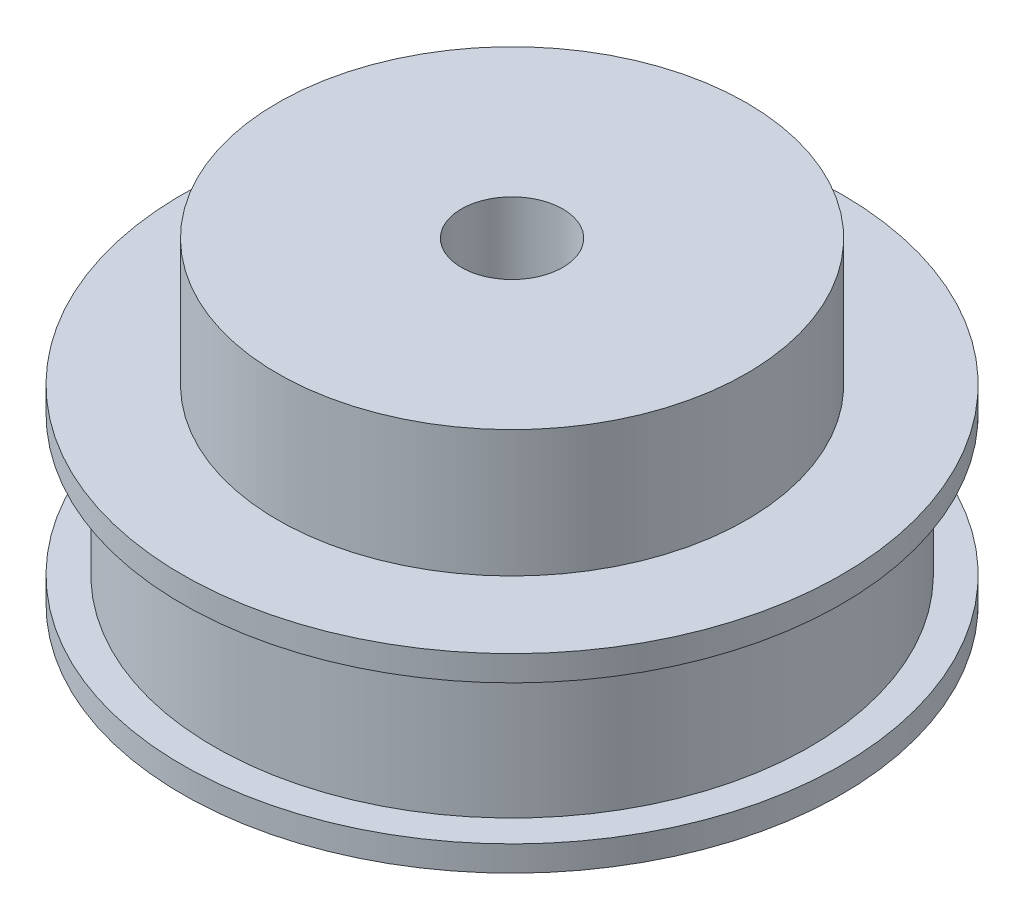
ISO-10303-21;
HEADER;
FILE_DESCRIPTION(('STEP AP214'),'2;1');
FILE_NAME('part.step','',(''),(''),'','','');
FILE_SCHEMA(('AUTOMOTIVE_DESIGN { 1 0 10303 214 1 1 1 1 }'));
ENDSEC;
DATA;
#1=APPLICATION_CONTEXT('core data for automotive mechanical design processes');
#2=APPLICATION_PROTOCOL_DEFINITION('international standard','automotive_design',2000,#1);
#3=PRODUCT_CONTEXT('',#1,'mechanical');
#4=PRODUCT('Part','Part','',(#3));
#5=PRODUCT_RELATED_PRODUCT_CATEGORY('part','',(#4));
#6=PRODUCT_DEFINITION_FORMATION('','',#4);
#7=PRODUCT_DEFINITION_CONTEXT('part definition',#1,'design');
#8=PRODUCT_DEFINITION('design','',#6,#7);
#9=PRODUCT_DEFINITION_SHAPE('','',#8);
#10=(LENGTH_UNIT() NAMED_UNIT(*) SI_UNIT(.MILLI.,.METRE.));
#11=(NAMED_UNIT(*) PLANE_ANGLE_UNIT() SI_UNIT($,.RADIAN.));
#12=(NAMED_UNIT(*) SI_UNIT($,.STERADIAN.) SOLID_ANGLE_UNIT());
#13=UNCERTAINTY_MEASURE_WITH_UNIT(LENGTH_MEASURE(1.E-05),#10,'distance_accuracy_value','');
#14=(GEOMETRIC_REPRESENTATION_CONTEXT(3) GLOBAL_UNCERTAINTY_ASSIGNED_CONTEXT((#13)) GLOBAL_UNIT_ASSIGNED_CONTEXT((#10,
#11,#12)) REPRESENTATION_CONTEXT('',''));
#15=CARTESIAN_POINT('',(0.,0.,0.));
#16=DIRECTION('',(0.,0.,1.));
#17=DIRECTION('',(1.,0.,0.));
#18=AXIS2_PLACEMENT_3D('',#15,#16,#17);
#19=CARTESIAN_POINT('',(18.5,11.6742242087626,0.));
#20=DIRECTION('',(0.,1.,0.));
#21=DIRECTION('',(0.,0.,1.));
#22=AXIS2_PLACEMENT_3D('',#19,#20,#21);
#23=PLANE('',#22);
#24=CARTESIAN_POINT('',(0.,11.6742242087626,0.));
#25=DIRECTION('',(0.,-1.,0.));
#26=DIRECTION('',(0.,0.,-1.));
#27=AXIS2_PLACEMENT_3D('',#24,#25,#26);
#28=CIRCLE('',#27,4.);
#29=CARTESIAN_POINT('',(0.,11.6742242087626,-4.));
#30=VERTEX_POINT('',#29);
#31=EDGE_CURVE('E10',#30,#30,#28,.T.);
#32=ORIENTED_EDGE('',*,*,#31,.T.);
#33=EDGE_LOOP('',(#32));
#34=FACE_BOUND('',#33,.T.);
#35=CARTESIAN_POINT('',(0.,11.6742242087626,0.));
#36=DIRECTION('',(0.,-1.,0.));
#37=DIRECTION('',(0.,0.,-1.));
#38=AXIS2_PLACEMENT_3D('',#35,#36,#37);
#39=CIRCLE('',#38,18.5);
#40=CARTESIAN_POINT('',(0.,11.6742242087626,-18.5));
#41=VERTEX_POINT('',#40);
#42=EDGE_CURVE('E84',#41,#41,#39,.T.);
#43=ORIENTED_EDGE('',*,*,#42,.F.);
#44=EDGE_LOOP('',(#43));
#45=FACE_BOUND('',#44,.T.);
#46=ADVANCED_FACE('F41',(#34,#45),#23,.T.);
#47=CARTESIAN_POINT('',(0.,0.,0.));
#48=DIRECTION('',(0.,-1.,0.));
#49=DIRECTION('',(0.,0.,-1.));
#50=AXIS2_PLACEMENT_3D('',#47,#48,#49);
#51=CYLINDRICAL_SURFACE('',#50,4.);
#52=CARTESIAN_POINT('',(0.,-13.3257757912374,0.));
#53=DIRECTION('',(0.,-1.,0.));
#54=DIRECTION('',(0.,0.,-1.));
#55=AXIS2_PLACEMENT_3D('',#52,#53,#54);
#56=CIRCLE('',#55,4.);
#57=CARTESIAN_POINT('',(0.,-13.3257757912374,-4.));
#58=VERTEX_POINT('',#57);
#59=EDGE_CURVE('E48',#58,#58,#56,.T.);
#60=ORIENTED_EDGE('',*,*,#59,.T.);
#61=EDGE_LOOP('',(#60));
#62=FACE_BOUND('',#61,.T.);
#63=ORIENTED_EDGE('',*,*,#31,.F.);
#64=EDGE_LOOP('',(#63));
#65=FACE_BOUND('',#64,.T.);
#66=ADVANCED_FACE('F93',(#62,#65),#51,.F.);
#67=CARTESIAN_POINT('',(4.,-13.3257757912374,0.));
#68=DIRECTION('',(0.,-1.,0.));
#69=DIRECTION('',(0.,0.,-1.));
#70=AXIS2_PLACEMENT_3D('',#67,#68,#69);
#71=PLANE('',#70);
#72=CARTESIAN_POINT('',(0.,-13.3257757912374,0.));
#73=DIRECTION('',(0.,-1.,0.));
#74=DIRECTION('',(0.,0.,-1.));
#75=AXIS2_PLACEMENT_3D('',#72,#73,#74);
#76=CIRCLE('',#75,26.);
#77=CARTESIAN_POINT('',(0.,-13.3257757912374,-26.));
#78=VERTEX_POINT('',#77);
#79=EDGE_CURVE('E53',#78,#78,#76,.T.);
#80=ORIENTED_EDGE('',*,*,#79,.T.);
#81=EDGE_LOOP('',(#80));
#82=FACE_BOUND('',#81,.T.);
#83=ORIENTED_EDGE('',*,*,#59,.F.);
#84=EDGE_LOOP('',(#83));
#85=FACE_BOUND('',#84,.T.);
#86=ADVANCED_FACE('F97',(#82,#85),#71,.T.);
#87=CARTESIAN_POINT('',(0.,0.,0.));
#88=DIRECTION('',(0.,-1.,0.));
#89=DIRECTION('',(0.,0.,-1.));
#90=AXIS2_PLACEMENT_3D('',#87,#88,#89);
#91=CYLINDRICAL_SURFACE('',#90,26.);
#92=CARTESIAN_POINT('',(0.,-11.3257757912374,0.));
#93=DIRECTION('',(0.,-1.,0.));
#94=DIRECTION('',(0.,0.,-1.));
#95=AXIS2_PLACEMENT_3D('',#92,#93,#94);
#96=CIRCLE('',#95,26.);
#97=CARTESIAN_POINT('',(0.,-11.3257757912374,-26.));
#98=VERTEX_POINT('',#97);
#99=EDGE_CURVE('E58',#98,#98,#96,.T.);
#100=ORIENTED_EDGE('',*,*,#99,.T.);
#101=EDGE_LOOP('',(#100));
#102=FACE_BOUND('',#101,.T.);
#103=ORIENTED_EDGE('',*,*,#79,.F.);
#104=EDGE_LOOP('',(#103));
#105=FACE_BOUND('',#104,.T.);
#106=ADVANCED_FACE('F101',(#102,#105),#91,.T.);
#107=CARTESIAN_POINT('',(26.,-11.3257757912374,0.));
#108=DIRECTION('',(0.,1.,0.));
#109=DIRECTION('',(0.,0.,1.));
#110=AXIS2_PLACEMENT_3D('',#107,#108,#109);
#111=PLANE('',#110);
#112=CARTESIAN_POINT('',(0.,-11.3257757912374,0.));
#113=DIRECTION('',(0.,-1.,0.));
#114=DIRECTION('',(0.,0.,-1.));
#115=AXIS2_PLACEMENT_3D('',#112,#113,#114);
#116=CIRCLE('',#115,23.5);
#117=CARTESIAN_POINT('',(0.,-11.3257757912374,-23.5));
#118=VERTEX_POINT('',#117);
#119=EDGE_CURVE('E64',#118,#118,#116,.T.);
#120=ORIENTED_EDGE('',*,*,#119,.T.);
#121=EDGE_LOOP('',(#120));
#122=FACE_BOUND('',#121,.T.);
#123=ORIENTED_EDGE('',*,*,#99,.F.);
#124=EDGE_LOOP('',(#123));
#125=FACE_BOUND('',#124,.T.);
#126=ADVANCED_FACE('F108',(#122,#125),#111,.T.);
#127=CARTESIAN_POINT('',(0.,0.,0.));
#128=DIRECTION('',(0.,-1.,0.));
#129=DIRECTION('',(0.,0.,-1.));
#130=AXIS2_PLACEMENT_3D('',#127,#128,#129);
#131=CYLINDRICAL_SURFACE('',#130,23.5);
#132=CARTESIAN_POINT('',(0.,-0.32577579123738,0.));
#133=DIRECTION('',(0.,-1.,0.));
#134=DIRECTION('',(0.,0.,-1.));
#135=AXIS2_PLACEMENT_3D('',#132,#133,#134);
#136=CIRCLE('',#135,23.5);
#137=CARTESIAN_POINT('',(0.,-0.32577579123738,-23.5));
#138=VERTEX_POINT('',#137);
#139=EDGE_CURVE('E68',#138,#138,#136,.T.);
#140=ORIENTED_EDGE('',*,*,#139,.T.);
#141=EDGE_LOOP('',(#140));
#142=FACE_BOUND('',#141,.T.);
#143=ORIENTED_EDGE('',*,*,#119,.F.);
#144=EDGE_LOOP('',(#143));
#145=FACE_BOUND('',#144,.T.);
#146=ADVANCED_FACE('F112',(#142,#145),#131,.T.);
#147=CARTESIAN_POINT('',(23.5,-0.32577579123738,0.));
#148=DIRECTION('',(0.,-1.,0.));
#149=DIRECTION('',(0.,0.,-1.));
#150=AXIS2_PLACEMENT_3D('',#147,#148,#149);
#151=PLANE('',#150);
#152=CARTESIAN_POINT('',(0.,-0.32577579123738,0.));
#153=DIRECTION('',(0.,-1.,0.));
#154=DIRECTION('',(0.,0.,-1.));
#155=AXIS2_PLACEMENT_3D('',#152,#153,#154);
#156=CIRCLE('',#155,26.);
#157=CARTESIAN_POINT('',(0.,-0.32577579123738,-26.));
#158=VERTEX_POINT('',#157);
#159=EDGE_CURVE('E72',#158,#158,#156,.T.);
#160=ORIENTED_EDGE('',*,*,#159,.T.);
#161=EDGE_LOOP('',(#160));
#162=FACE_BOUND('',#161,.T.);
#163=ORIENTED_EDGE('',*,*,#139,.F.);
#164=EDGE_LOOP('',(#163));
#165=FACE_BOUND('',#164,.T.);
#166=ADVANCED_FACE('F116',(#162,#165),#151,.T.);
#167=CARTESIAN_POINT('',(0.,0.,0.));
#168=DIRECTION('',(0.,-1.,0.));
#169=DIRECTION('',(0.,0.,-1.));
#170=AXIS2_PLACEMENT_3D('',#167,#168,#169);
#171=CYLINDRICAL_SURFACE('',#170,26.);
#172=CARTESIAN_POINT('',(0.,1.67422420876262,0.));
#173=DIRECTION('',(0.,-1.,0.));
#174=DIRECTION('',(0.,0.,-1.));
#175=AXIS2_PLACEMENT_3D('',#172,#173,#174);
#176=CIRCLE('',#175,26.);
#177=CARTESIAN_POINT('',(0.,1.67422420876262,-26.));
#178=VERTEX_POINT('',#177);
#179=EDGE_CURVE('E76',#178,#178,#176,.T.);
#180=ORIENTED_EDGE('',*,*,#179,.T.);
#181=EDGE_LOOP('',(#180));
#182=FACE_BOUND('',#181,.T.);
#183=ORIENTED_EDGE('',*,*,#159,.F.);
#184=EDGE_LOOP('',(#183));
#185=FACE_BOUND('',#184,.T.);
#186=ADVANCED_FACE('F120',(#182,#185),#171,.T.);
#187=CARTESIAN_POINT('',(26.,1.67422420876262,0.));
#188=DIRECTION('',(0.,1.,0.));
#189=DIRECTION('',(0.,0.,1.));
#190=AXIS2_PLACEMENT_3D('',#187,#188,#189);
#191=PLANE('',#190);
#192=CARTESIAN_POINT('',(0.,1.67422420876262,0.));
#193=DIRECTION('',(0.,-1.,0.));
#194=DIRECTION('',(0.,0.,-1.));
#195=AXIS2_PLACEMENT_3D('',#192,#193,#194);
#196=CIRCLE('',#195,18.5);
#197=CARTESIAN_POINT('',(0.,1.67422420876262,-18.5));
#198=VERTEX_POINT('',#197);
#199=EDGE_CURVE('E80',#198,#198,#196,.T.);
#200=ORIENTED_EDGE('',*,*,#199,.T.);
#201=EDGE_LOOP('',(#200));
#202=FACE_BOUND('',#201,.T.);
#203=ORIENTED_EDGE('',*,*,#179,.F.);
#204=EDGE_LOOP('',(#203));
#205=FACE_BOUND('',#204,.T.);
#206=ADVANCED_FACE('F124',(#202,#205),#191,.T.);
#207=CARTESIAN_POINT('',(0.,0.,0.));
#208=DIRECTION('',(0.,-1.,0.));
#209=DIRECTION('',(0.,0.,-1.));
#210=AXIS2_PLACEMENT_3D('',#207,#208,#209);
#211=CYLINDRICAL_SURFACE('',#210,18.5);
#212=ORIENTED_EDGE('',*,*,#42,.T.);
#213=EDGE_LOOP('',(#212));
#214=FACE_BOUND('',#213,.T.);
#215=ORIENTED_EDGE('',*,*,#199,.F.);
#216=EDGE_LOOP('',(#215));
#217=FACE_BOUND('',#216,.T.);
#218=ADVANCED_FACE('F89',(#214,#217),#211,.T.);
#219=CLOSED_SHELL('',(#46,#66,#86,#106,#126,#146,#166,#186,#206,#218));
#220=MANIFOLD_SOLID_BREP('B2',#219);
#221=ADVANCED_BREP_SHAPE_REPRESENTATION('',(#18,#220),#14);
#222=SHAPE_DEFINITION_REPRESENTATION(#9,#221);
ENDSEC;
END-ISO-10303-21;
